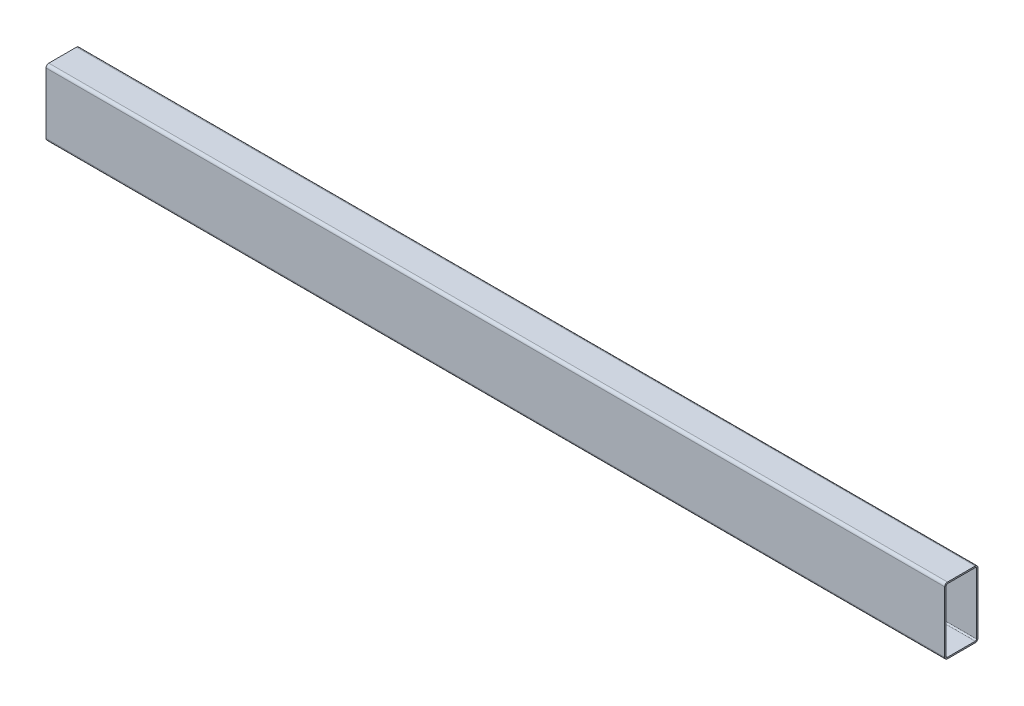
ISO-10303-21;
HEADER;
FILE_DESCRIPTION(('STEP AP214'),'2;1');
FILE_NAME('part.step','',(''),(''),'','','');
FILE_SCHEMA(('AUTOMOTIVE_DESIGN { 1 0 10303 214 1 1 1 1 }'));
ENDSEC;
DATA;
#1=APPLICATION_CONTEXT('core data for automotive mechanical design processes');
#2=APPLICATION_PROTOCOL_DEFINITION('international standard','automotive_design',2000,#1);
#3=PRODUCT_CONTEXT('',#1,'mechanical');
#4=PRODUCT('Part','Part','',(#3));
#5=PRODUCT_RELATED_PRODUCT_CATEGORY('part','',(#4));
#6=PRODUCT_DEFINITION_FORMATION('','',#4);
#7=PRODUCT_DEFINITION_CONTEXT('part definition',#1,'design');
#8=PRODUCT_DEFINITION('design','',#6,#7);
#9=PRODUCT_DEFINITION_SHAPE('','',#8);
#10=(LENGTH_UNIT() NAMED_UNIT(*) SI_UNIT(.MILLI.,.METRE.));
#11=(NAMED_UNIT(*) PLANE_ANGLE_UNIT() SI_UNIT($,.RADIAN.));
#12=(NAMED_UNIT(*) SI_UNIT($,.STERADIAN.) SOLID_ANGLE_UNIT());
#13=UNCERTAINTY_MEASURE_WITH_UNIT(LENGTH_MEASURE(1.E-05),#10,'distance_accuracy_value','');
#14=(GEOMETRIC_REPRESENTATION_CONTEXT(3) GLOBAL_UNCERTAINTY_ASSIGNED_CONTEXT((#13)) GLOBAL_UNIT_ASSIGNED_CONTEXT((#10,
#11,#12)) REPRESENTATION_CONTEXT('',''));
#15=CARTESIAN_POINT('',(0.,0.,0.));
#16=DIRECTION('',(0.,0.,1.));
#17=DIRECTION('',(1.,0.,0.));
#18=AXIS2_PLACEMENT_3D('',#15,#16,#17);
#19=CARTESIAN_POINT('',(1028.7,-7.09083333333333,9.49713055555553));
#20=DIRECTION('',(1.,0.,0.));
#21=DIRECTION('',(0.,0.,-1.));
#22=AXIS2_PLACEMENT_3D('',#19,#20,#21);
#23=PLANE('',#22);
#24=CARTESIAN_POINT('',(1028.7,-7.09083333333333,9.49713055555553));
#25=DIRECTION('',(1.,0.,0.));
#26=DIRECTION('',(0.,0.,-1.));
#27=AXIS2_PLACEMENT_3D('',#24,#25,#26);
#28=CIRCLE('',#27,3.175);
#29=CARTESIAN_POINT('',(1028.7,-7.09083333333333,12.6721305555555));
#30=VERTEX_POINT('',#29);
#31=CARTESIAN_POINT('',(1028.7,-10.2658333333333,9.49713055555553));
#32=VERTEX_POINT('',#31);
#33=EDGE_CURVE('E262',#30,#32,#28,.T.);
#34=ORIENTED_EDGE('',*,*,#33,.T.);
#35=DIRECTION('',(0.,0.,-1.));
#36=VECTOR('',#35,1.);
#37=CARTESIAN_POINT('',(1028.7,-10.2658333333333,9.49713055555553));
#38=LINE('',#37,#36);
#39=CARTESIAN_POINT('',(1028.7,-10.2658333333333,-22.2528694444445));
#40=VERTEX_POINT('',#39);
#41=EDGE_CURVE('E265',#32,#40,#38,.T.);
#42=ORIENTED_EDGE('',*,*,#41,.T.);
#43=CARTESIAN_POINT('',(1028.7,-7.09083333333333,-22.2528694444445));
#44=DIRECTION('',(1.,0.,0.));
#45=DIRECTION('',(0.,0.,-1.));
#46=AXIS2_PLACEMENT_3D('',#43,#44,#45);
#47=CIRCLE('',#46,3.175);
#48=CARTESIAN_POINT('',(1028.7,-7.09083333333333,-25.4278694444445));
#49=VERTEX_POINT('',#48);
#50=EDGE_CURVE('E268',#40,#49,#47,.T.);
#51=ORIENTED_EDGE('',*,*,#50,.T.);
#52=DIRECTION('',(0.,1.,0.));
#53=VECTOR('',#52,1.);
#54=CARTESIAN_POINT('',(1028.7,-7.09083333333333,-25.4278694444445));
#55=LINE('',#54,#53);
#56=CARTESIAN_POINT('',(1028.7,62.7591666666666,-25.4278694444445));
#57=VERTEX_POINT('',#56);
#58=EDGE_CURVE('E270',#49,#57,#55,.T.);
#59=ORIENTED_EDGE('',*,*,#58,.T.);
#60=CARTESIAN_POINT('',(1028.7,62.7591666666667,-22.2528694444445));
#61=DIRECTION('',(1.,0.,0.));
#62=DIRECTION('',(0.,0.,-1.));
#63=AXIS2_PLACEMENT_3D('',#60,#61,#62);
#64=CIRCLE('',#63,3.175);
#65=CARTESIAN_POINT('',(1028.7,65.9341666666667,-22.2528694444445));
#66=VERTEX_POINT('',#65);
#67=EDGE_CURVE('E272',#57,#66,#64,.T.);
#68=ORIENTED_EDGE('',*,*,#67,.T.);
#69=DIRECTION('',(0.,0.,-1.));
#70=VECTOR('',#69,1.);
#71=CARTESIAN_POINT('',(1028.7,65.9341666666667,9.4971305555555));
#72=LINE('',#71,#70);
#73=CARTESIAN_POINT('',(1028.7,65.9341666666667,9.4971305555555));
#74=VERTEX_POINT('',#73);
#75=EDGE_CURVE('E274',#74,#66,#72,.T.);
#76=ORIENTED_EDGE('',*,*,#75,.F.);
#77=CARTESIAN_POINT('',(1028.7,62.7591666666667,9.49713055555553));
#78=DIRECTION('',(-1.,0.,0.));
#79=DIRECTION('',(0.,0.,1.));
#80=AXIS2_PLACEMENT_3D('',#77,#78,#79);
#81=CIRCLE('',#80,3.175);
#82=CARTESIAN_POINT('',(1028.7,62.7591666666666,12.6721305555555));
#83=VERTEX_POINT('',#82);
#84=EDGE_CURVE('E277',#83,#74,#81,.T.);
#85=ORIENTED_EDGE('',*,*,#84,.F.);
#86=DIRECTION('',(0.,1.,0.));
#87=VECTOR('',#86,1.);
#88=CARTESIAN_POINT('',(1028.7,-7.09083333333333,12.6721305555555));
#89=LINE('',#88,#87);
#90=EDGE_CURVE('E280',#30,#83,#89,.T.);
#91=ORIENTED_EDGE('',*,*,#90,.F.);
#92=EDGE_LOOP('',(#34,#42,#51,#59,#68,#76,#85,#91));
#93=FACE_BOUND('',#92,.T.);
#94=DIRECTION('',(0.,0.,-1.));
#95=VECTOR('',#94,1.);
#96=CARTESIAN_POINT('',(1028.7,-8.61483333333334,9.49713055555553));
#97=LINE('',#96,#95);
#98=CARTESIAN_POINT('',(1028.7,-8.61483333333334,9.49713055555553));
#99=VERTEX_POINT('',#98);
#100=CARTESIAN_POINT('',(1028.7,-8.61483333333334,-22.2528694444445));
#101=VERTEX_POINT('',#100);
#102=EDGE_CURVE('E204',#99,#101,#97,.T.);
#103=ORIENTED_EDGE('',*,*,#102,.F.);
#104=CARTESIAN_POINT('',(1028.7,-7.09083333333333,9.49713055555553));
#105=DIRECTION('',(1.,0.,0.));
#106=DIRECTION('',(0.,0.,-1.));
#107=AXIS2_PLACEMENT_3D('',#104,#105,#106);
#108=CIRCLE('',#107,1.524);
#109=CARTESIAN_POINT('',(1028.7,-7.09083333333333,11.0211305555555));
#110=VERTEX_POINT('',#109);
#111=EDGE_CURVE('E195',#110,#99,#108,.T.);
#112=ORIENTED_EDGE('',*,*,#111,.F.);
#113=DIRECTION('',(0.,1.,0.));
#114=VECTOR('',#113,1.);
#115=CARTESIAN_POINT('',(1028.7,-7.09083333333333,11.0211305555555));
#116=LINE('',#115,#114);
#117=CARTESIAN_POINT('',(1028.7,62.7591666666666,11.0211305555555));
#118=VERTEX_POINT('',#117);
#119=EDGE_CURVE('E229',#110,#118,#116,.T.);
#120=ORIENTED_EDGE('',*,*,#119,.T.);
#121=CARTESIAN_POINT('',(1028.7,62.7591666666667,9.49713055555553));
#122=DIRECTION('',(1.,0.,0.));
#123=DIRECTION('',(0.,0.,-1.));
#124=AXIS2_PLACEMENT_3D('',#121,#122,#123);
#125=CIRCLE('',#124,1.524);
#126=CARTESIAN_POINT('',(1028.7,64.2831666666667,9.49713055555551));
#127=VERTEX_POINT('',#126);
#128=EDGE_CURVE('E98',#118,#127,#125,.F.);
#129=ORIENTED_EDGE('',*,*,#128,.T.);
#130=DIRECTION('',(0.,0.,-1.));
#131=VECTOR('',#130,1.);
#132=CARTESIAN_POINT('',(1028.7,64.2831666666667,9.4971305555555));
#133=LINE('',#132,#131);
#134=CARTESIAN_POINT('',(1028.7,64.2831666666667,-22.2528694444444));
#135=VERTEX_POINT('',#134);
#136=EDGE_CURVE('E225',#127,#135,#133,.T.);
#137=ORIENTED_EDGE('',*,*,#136,.T.);
#138=CARTESIAN_POINT('',(1028.7,62.7591666666667,-22.2528694444445));
#139=DIRECTION('',(1.,0.,0.));
#140=DIRECTION('',(0.,0.,-1.));
#141=AXIS2_PLACEMENT_3D('',#138,#139,#140);
#142=CIRCLE('',#141,1.524);
#143=CARTESIAN_POINT('',(1028.7,62.7591666666666,-23.7768694444445));
#144=VERTEX_POINT('',#143);
#145=EDGE_CURVE('E223',#144,#135,#142,.T.);
#146=ORIENTED_EDGE('',*,*,#145,.F.);
#147=DIRECTION('',(0.,1.,0.));
#148=VECTOR('',#147,1.);
#149=CARTESIAN_POINT('',(1028.7,-7.09083333333333,-23.7768694444445));
#150=LINE('',#149,#148);
#151=CARTESIAN_POINT('',(1028.7,-7.09083333333333,-23.7768694444445));
#152=VERTEX_POINT('',#151);
#153=EDGE_CURVE('E219',#152,#144,#150,.T.);
#154=ORIENTED_EDGE('',*,*,#153,.F.);
#155=CARTESIAN_POINT('',(1028.7,-7.09083333333333,-22.2528694444445));
#156=DIRECTION('',(1.,0.,0.));
#157=DIRECTION('',(0.,0.,-1.));
#158=AXIS2_PLACEMENT_3D('',#155,#156,#157);
#159=CIRCLE('',#158,1.524);
#160=EDGE_CURVE('E217',#101,#152,#159,.T.);
#161=ORIENTED_EDGE('',*,*,#160,.F.);
#162=EDGE_LOOP('',(#103,#112,#120,#129,#137,#146,#154,#161));
#163=FACE_BOUND('',#162,.T.);
#164=ADVANCED_FACE('F83',(#93,#163),#23,.T.);
#165=CARTESIAN_POINT('',(0.,-7.09083333333333,9.49713055555553));
#166=DIRECTION('',(1.,0.,0.));
#167=DIRECTION('',(0.,0.,-1.));
#168=AXIS2_PLACEMENT_3D('',#165,#166,#167);
#169=PLANE('',#168);
#170=CARTESIAN_POINT('',(0.,-7.09083333333333,9.49713055555553));
#171=DIRECTION('',(1.,0.,0.));
#172=DIRECTION('',(0.,0.,-1.));
#173=AXIS2_PLACEMENT_3D('',#170,#171,#172);
#174=CIRCLE('',#173,3.175);
#175=CARTESIAN_POINT('',(0.,-7.09083333333333,12.6721305555555));
#176=VERTEX_POINT('',#175);
#177=CARTESIAN_POINT('',(0.,-10.2658333333333,9.49713055555553));
#178=VERTEX_POINT('',#177);
#179=EDGE_CURVE('E212',#176,#178,#174,.T.);
#180=ORIENTED_EDGE('',*,*,#179,.F.);
#181=DIRECTION('',(0.,1.,0.));
#182=VECTOR('',#181,1.);
#183=CARTESIAN_POINT('',(0.,-7.09083333333333,12.6721305555555));
#184=LINE('',#183,#182);
#185=CARTESIAN_POINT('',(0.,62.7591666666666,12.6721305555555));
#186=VERTEX_POINT('',#185);
#187=EDGE_CURVE('E266',#176,#186,#184,.T.);
#188=ORIENTED_EDGE('',*,*,#187,.T.);
#189=CARTESIAN_POINT('',(0.,62.7591666666667,9.49713055555553));
#190=DIRECTION('',(-1.,0.,0.));
#191=DIRECTION('',(0.,0.,1.));
#192=AXIS2_PLACEMENT_3D('',#189,#190,#191);
#193=CIRCLE('',#192,3.175);
#194=CARTESIAN_POINT('',(0.,65.9341666666667,9.4971305555555));
#195=VERTEX_POINT('',#194);
#196=EDGE_CURVE('E298',#186,#195,#193,.T.);
#197=ORIENTED_EDGE('',*,*,#196,.T.);
#198=DIRECTION('',(0.,0.,-1.));
#199=VECTOR('',#198,1.);
#200=CARTESIAN_POINT('',(0.,65.9341666666667,9.4971305555555));
#201=LINE('',#200,#199);
#202=CARTESIAN_POINT('',(0.,65.9341666666667,-22.2528694444445));
#203=VERTEX_POINT('',#202);
#204=EDGE_CURVE('E295',#195,#203,#201,.T.);
#205=ORIENTED_EDGE('',*,*,#204,.T.);
#206=CARTESIAN_POINT('',(0.,62.7591666666667,-22.2528694444445));
#207=DIRECTION('',(1.,0.,0.));
#208=DIRECTION('',(0.,0.,-1.));
#209=AXIS2_PLACEMENT_3D('',#206,#207,#208);
#210=CIRCLE('',#209,3.175);
#211=CARTESIAN_POINT('',(0.,62.7591666666666,-25.4278694444445));
#212=VERTEX_POINT('',#211);
#213=EDGE_CURVE('E292',#212,#203,#210,.T.);
#214=ORIENTED_EDGE('',*,*,#213,.F.);
#215=DIRECTION('',(0.,1.,0.));
#216=VECTOR('',#215,1.);
#217=CARTESIAN_POINT('',(0.,-7.09083333333333,-25.4278694444445));
#218=LINE('',#217,#216);
#219=CARTESIAN_POINT('',(0.,-7.09083333333333,-25.4278694444445));
#220=VERTEX_POINT('',#219);
#221=EDGE_CURVE('E290',#220,#212,#218,.T.);
#222=ORIENTED_EDGE('',*,*,#221,.F.);
#223=CARTESIAN_POINT('',(0.,-7.09083333333333,-22.2528694444445));
#224=DIRECTION('',(1.,0.,0.));
#225=DIRECTION('',(0.,0.,-1.));
#226=AXIS2_PLACEMENT_3D('',#223,#224,#225);
#227=CIRCLE('',#226,3.175);
#228=CARTESIAN_POINT('',(0.,-10.2658333333333,-22.2528694444445));
#229=VERTEX_POINT('',#228);
#230=EDGE_CURVE('E288',#229,#220,#227,.T.);
#231=ORIENTED_EDGE('',*,*,#230,.F.);
#232=DIRECTION('',(0.,0.,-1.));
#233=VECTOR('',#232,1.);
#234=CARTESIAN_POINT('',(0.,-10.2658333333333,9.49713055555553));
#235=LINE('',#234,#233);
#236=EDGE_CURVE('E286',#178,#229,#235,.T.);
#237=ORIENTED_EDGE('',*,*,#236,.F.);
#238=EDGE_LOOP('',(#180,#188,#197,#205,#214,#222,#231,#237));
#239=FACE_BOUND('',#238,.T.);
#240=CARTESIAN_POINT('',(0.,-7.09083333333333,9.49713055555553));
#241=DIRECTION('',(1.,0.,0.));
#242=DIRECTION('',(0.,0.,-1.));
#243=AXIS2_PLACEMENT_3D('',#240,#241,#242);
#244=CIRCLE('',#243,1.524);
#245=CARTESIAN_POINT('',(0.,-7.09083333333333,11.0211305555555));
#246=VERTEX_POINT('',#245);
#247=CARTESIAN_POINT('',(0.,-8.61483333333334,9.49713055555553));
#248=VERTEX_POINT('',#247);
#249=EDGE_CURVE('E106',#246,#248,#244,.T.);
#250=ORIENTED_EDGE('',*,*,#249,.T.);
#251=DIRECTION('',(0.,0.,-1.));
#252=VECTOR('',#251,1.);
#253=CARTESIAN_POINT('',(0.,-8.61483333333334,9.49713055555553));
#254=LINE('',#253,#252);
#255=CARTESIAN_POINT('',(0.,-8.61483333333334,-22.2528694444445));
#256=VERTEX_POINT('',#255);
#257=EDGE_CURVE('E211',#248,#256,#254,.T.);
#258=ORIENTED_EDGE('',*,*,#257,.T.);
#259=CARTESIAN_POINT('',(0.,-7.09083333333333,-22.2528694444445));
#260=DIRECTION('',(1.,0.,0.));
#261=DIRECTION('',(0.,0.,-1.));
#262=AXIS2_PLACEMENT_3D('',#259,#260,#261);
#263=CIRCLE('',#262,1.524);
#264=CARTESIAN_POINT('',(0.,-7.09083333333333,-23.7768694444445));
#265=VERTEX_POINT('',#264);
#266=EDGE_CURVE('E233',#256,#265,#263,.T.);
#267=ORIENTED_EDGE('',*,*,#266,.T.);
#268=DIRECTION('',(0.,1.,0.));
#269=VECTOR('',#268,1.);
#270=CARTESIAN_POINT('',(0.,-7.09083333333333,-23.7768694444445));
#271=LINE('',#270,#269);
#272=CARTESIAN_POINT('',(0.,62.7591666666666,-23.7768694444445));
#273=VERTEX_POINT('',#272);
#274=EDGE_CURVE('E236',#265,#273,#271,.T.);
#275=ORIENTED_EDGE('',*,*,#274,.T.);
#276=CARTESIAN_POINT('',(0.,62.7591666666667,-22.2528694444445));
#277=DIRECTION('',(1.,0.,0.));
#278=DIRECTION('',(0.,0.,-1.));
#279=AXIS2_PLACEMENT_3D('',#276,#277,#278);
#280=CIRCLE('',#279,1.524);
#281=CARTESIAN_POINT('',(0.,64.2831666666667,-22.2528694444444));
#282=VERTEX_POINT('',#281);
#283=EDGE_CURVE('E239',#273,#282,#280,.T.);
#284=ORIENTED_EDGE('',*,*,#283,.T.);
#285=DIRECTION('',(0.,0.,-1.));
#286=VECTOR('',#285,1.);
#287=CARTESIAN_POINT('',(0.,64.2831666666667,9.4971305555555));
#288=LINE('',#287,#286);
#289=CARTESIAN_POINT('',(0.,64.2831666666667,9.49713055555551));
#290=VERTEX_POINT('',#289);
#291=EDGE_CURVE('E242',#290,#282,#288,.T.);
#292=ORIENTED_EDGE('',*,*,#291,.F.);
#293=CARTESIAN_POINT('',(0.,62.7591666666667,9.49713055555553));
#294=DIRECTION('',(1.,0.,0.));
#295=DIRECTION('',(0.,0.,-1.));
#296=AXIS2_PLACEMENT_3D('',#293,#294,#295);
#297=CIRCLE('',#296,1.524);
#298=CARTESIAN_POINT('',(0.,62.7591666666666,11.0211305555555));
#299=VERTEX_POINT('',#298);
#300=EDGE_CURVE('E245',#299,#290,#297,.F.);
#301=ORIENTED_EDGE('',*,*,#300,.F.);
#302=DIRECTION('',(0.,1.,0.));
#303=VECTOR('',#302,1.);
#304=CARTESIAN_POINT('',(0.,-7.09083333333333,11.0211305555555));
#305=LINE('',#304,#303);
#306=EDGE_CURVE('E205',#246,#299,#305,.T.);
#307=ORIENTED_EDGE('',*,*,#306,.F.);
#308=EDGE_LOOP('',(#250,#258,#267,#275,#284,#292,#301,#307));
#309=FACE_BOUND('',#308,.T.);
#310=ADVANCED_FACE('F326',(#239,#309),#169,.F.);
#311=CARTESIAN_POINT('',(1028.7,-7.09083333333333,9.49713055555553));
#312=DIRECTION('',(-1.,0.,0.));
#313=DIRECTION('',(0.,0.,1.));
#314=AXIS2_PLACEMENT_3D('',#311,#312,#313);
#315=CYLINDRICAL_SURFACE('',#314,3.175);
#316=ORIENTED_EDGE('',*,*,#179,.T.);
#317=DIRECTION('',(-1.,0.,0.));
#318=VECTOR('',#317,1.);
#319=CARTESIAN_POINT('',(1028.7,-10.2658333333333,9.49713055555553));
#320=LINE('',#319,#318);
#321=EDGE_CURVE('E12',#32,#178,#320,.T.);
#322=ORIENTED_EDGE('',*,*,#321,.F.);
#323=ORIENTED_EDGE('',*,*,#33,.F.);
#324=DIRECTION('',(-1.,0.,0.));
#325=VECTOR('',#324,1.);
#326=CARTESIAN_POINT('',(1028.7,-7.09083333333333,12.6721305555555));
#327=LINE('',#326,#325);
#328=EDGE_CURVE('E283',#30,#176,#327,.T.);
#329=ORIENTED_EDGE('',*,*,#328,.T.);
#330=EDGE_LOOP('',(#316,#322,#323,#329));
#331=FACE_BOUND('',#330,.T.);
#332=ADVANCED_FACE('F85',(#331),#315,.T.);
#333=CARTESIAN_POINT('',(1028.7,-10.2658333333333,9.49713055555553));
#334=DIRECTION('',(0.,1.,0.));
#335=DIRECTION('',(0.,0.,1.));
#336=AXIS2_PLACEMENT_3D('',#333,#334,#335);
#337=PLANE('',#336);
#338=ORIENTED_EDGE('',*,*,#236,.T.);
#339=DIRECTION('',(-1.,0.,0.));
#340=VECTOR('',#339,1.);
#341=CARTESIAN_POINT('',(1028.7,-10.2658333333333,-22.2528694444445));
#342=LINE('',#341,#340);
#343=EDGE_CURVE('E91',#40,#229,#342,.T.);
#344=ORIENTED_EDGE('',*,*,#343,.F.);
#345=ORIENTED_EDGE('',*,*,#41,.F.);
#346=ORIENTED_EDGE('',*,*,#321,.T.);
#347=EDGE_LOOP('',(#338,#344,#345,#346));
#348=FACE_BOUND('',#347,.T.);
#349=ADVANCED_FACE('F343',(#348),#337,.F.);
#350=CARTESIAN_POINT('',(1028.7,-7.09083333333333,-22.2528694444445));
#351=DIRECTION('',(-1.,0.,0.));
#352=DIRECTION('',(0.,0.,1.));
#353=AXIS2_PLACEMENT_3D('',#350,#351,#352);
#354=CYLINDRICAL_SURFACE('',#353,3.175);
#355=ORIENTED_EDGE('',*,*,#230,.T.);
#356=DIRECTION('',(-1.,0.,0.));
#357=VECTOR('',#356,1.);
#358=CARTESIAN_POINT('',(1028.7,-7.09083333333333,-25.4278694444445));
#359=LINE('',#358,#357);
#360=EDGE_CURVE('E313',#49,#220,#359,.T.);
#361=ORIENTED_EDGE('',*,*,#360,.F.);
#362=ORIENTED_EDGE('',*,*,#50,.F.);
#363=ORIENTED_EDGE('',*,*,#343,.T.);
#364=EDGE_LOOP('',(#355,#361,#362,#363));
#365=FACE_BOUND('',#364,.T.);
#366=ADVANCED_FACE('F320',(#365),#354,.T.);
#367=CARTESIAN_POINT('',(1028.7,-7.09083333333333,-25.4278694444445));
#368=DIRECTION('',(0.,0.,1.));
#369=DIRECTION('',(1.,0.,0.));
#370=AXIS2_PLACEMENT_3D('',#367,#368,#369);
#371=PLANE('',#370);
#372=ORIENTED_EDGE('',*,*,#221,.T.);
#373=DIRECTION('',(-1.,0.,0.));
#374=VECTOR('',#373,1.);
#375=CARTESIAN_POINT('',(1028.7,62.7591666666666,-25.4278694444445));
#376=LINE('',#375,#374);
#377=EDGE_CURVE('E310',#57,#212,#376,.T.);
#378=ORIENTED_EDGE('',*,*,#377,.F.);
#379=ORIENTED_EDGE('',*,*,#58,.F.);
#380=ORIENTED_EDGE('',*,*,#360,.T.);
#381=EDGE_LOOP('',(#372,#378,#379,#380));
#382=FACE_BOUND('',#381,.T.);
#383=ADVANCED_FACE('F331',(#382),#371,.F.);
#384=CARTESIAN_POINT('',(1028.7,62.7591666666667,-22.2528694444445));
#385=DIRECTION('',(-1.,0.,0.));
#386=DIRECTION('',(0.,0.,1.));
#387=AXIS2_PLACEMENT_3D('',#384,#385,#386);
#388=CYLINDRICAL_SURFACE('',#387,3.175);
#389=ORIENTED_EDGE('',*,*,#213,.T.);
#390=DIRECTION('',(-1.,0.,0.));
#391=VECTOR('',#390,1.);
#392=CARTESIAN_POINT('',(1028.7,65.9341666666667,-22.2528694444445));
#393=LINE('',#392,#391);
#394=EDGE_CURVE('E308',#66,#203,#393,.T.);
#395=ORIENTED_EDGE('',*,*,#394,.F.);
#396=ORIENTED_EDGE('',*,*,#67,.F.);
#397=ORIENTED_EDGE('',*,*,#377,.T.);
#398=EDGE_LOOP('',(#389,#395,#396,#397));
#399=FACE_BOUND('',#398,.T.);
#400=ADVANCED_FACE('F335',(#399),#388,.T.);
#401=CARTESIAN_POINT('',(1028.7,65.9341666666667,9.4971305555555));
#402=DIRECTION('',(0.,1.,0.));
#403=DIRECTION('',(0.,0.,1.));
#404=AXIS2_PLACEMENT_3D('',#401,#402,#403);
#405=PLANE('',#404);
#406=ORIENTED_EDGE('',*,*,#204,.F.);
#407=DIRECTION('',(-1.,0.,0.));
#408=VECTOR('',#407,1.);
#409=CARTESIAN_POINT('',(1028.7,65.9341666666667,9.4971305555555));
#410=LINE('',#409,#408);
#411=EDGE_CURVE('E306',#74,#195,#410,.T.);
#412=ORIENTED_EDGE('',*,*,#411,.F.);
#413=ORIENTED_EDGE('',*,*,#75,.T.);
#414=ORIENTED_EDGE('',*,*,#394,.T.);
#415=EDGE_LOOP('',(#406,#412,#413,#414));
#416=FACE_BOUND('',#415,.T.);
#417=ADVANCED_FACE('F353',(#416),#405,.T.);
#418=CARTESIAN_POINT('',(1028.7,62.7591666666667,9.49713055555553));
#419=DIRECTION('',(-1.,0.,0.));
#420=DIRECTION('',(0.,0.,1.));
#421=AXIS2_PLACEMENT_3D('',#418,#419,#420);
#422=CYLINDRICAL_SURFACE('',#421,3.175);
#423=ORIENTED_EDGE('',*,*,#196,.F.);
#424=DIRECTION('',(-1.,0.,0.));
#425=VECTOR('',#424,1.);
#426=CARTESIAN_POINT('',(1028.7,62.7591666666666,12.6721305555555));
#427=LINE('',#426,#425);
#428=EDGE_CURVE('E304',#83,#186,#427,.T.);
#429=ORIENTED_EDGE('',*,*,#428,.F.);
#430=ORIENTED_EDGE('',*,*,#84,.T.);
#431=ORIENTED_EDGE('',*,*,#411,.T.);
#432=EDGE_LOOP('',(#423,#429,#430,#431));
#433=FACE_BOUND('',#432,.T.);
#434=ADVANCED_FACE('F350',(#433),#422,.T.);
#435=CARTESIAN_POINT('',(1028.7,-7.09083333333333,12.6721305555555));
#436=DIRECTION('',(0.,0.,1.));
#437=DIRECTION('',(1.,0.,0.));
#438=AXIS2_PLACEMENT_3D('',#435,#436,#437);
#439=PLANE('',#438);
#440=ORIENTED_EDGE('',*,*,#187,.F.);
#441=ORIENTED_EDGE('',*,*,#328,.F.);
#442=ORIENTED_EDGE('',*,*,#90,.T.);
#443=ORIENTED_EDGE('',*,*,#428,.T.);
#444=EDGE_LOOP('',(#440,#441,#442,#443));
#445=FACE_BOUND('',#444,.T.);
#446=ADVANCED_FACE('F347',(#445),#439,.T.);
#447=CARTESIAN_POINT('',(1028.7,-7.09083333333333,9.49713055555553));
#448=DIRECTION('',(-1.,0.,0.));
#449=DIRECTION('',(0.,0.,1.));
#450=AXIS2_PLACEMENT_3D('',#447,#448,#449);
#451=CYLINDRICAL_SURFACE('',#450,1.524);
#452=ORIENTED_EDGE('',*,*,#249,.F.);
#453=DIRECTION('',(-1.,0.,0.));
#454=VECTOR('',#453,1.);
#455=CARTESIAN_POINT('',(1028.7,-7.09083333333333,11.0211305555555));
#456=LINE('',#455,#454);
#457=EDGE_CURVE('E199',#110,#246,#456,.T.);
#458=ORIENTED_EDGE('',*,*,#457,.F.);
#459=ORIENTED_EDGE('',*,*,#111,.T.);
#460=DIRECTION('',(-1.,0.,0.));
#461=VECTOR('',#460,1.);
#462=CARTESIAN_POINT('',(1028.7,-8.61483333333334,9.49713055555553));
#463=LINE('',#462,#461);
#464=EDGE_CURVE('E198',#99,#248,#463,.T.);
#465=ORIENTED_EDGE('',*,*,#464,.T.);
#466=EDGE_LOOP('',(#452,#458,#459,#465));
#467=FACE_BOUND('',#466,.T.);
#468=ADVANCED_FACE('F197',(#467),#451,.F.);
#469=CARTESIAN_POINT('',(1028.7,-8.61483333333334,9.49713055555553));
#470=DIRECTION('',(0.,1.,0.));
#471=DIRECTION('',(0.,0.,1.));
#472=AXIS2_PLACEMENT_3D('',#469,#470,#471);
#473=PLANE('',#472);
#474=ORIENTED_EDGE('',*,*,#257,.F.);
#475=ORIENTED_EDGE('',*,*,#464,.F.);
#476=ORIENTED_EDGE('',*,*,#102,.T.);
#477=DIRECTION('',(-1.,0.,0.));
#478=VECTOR('',#477,1.);
#479=CARTESIAN_POINT('',(1028.7,-8.61483333333334,-22.2528694444445));
#480=LINE('',#479,#478);
#481=EDGE_CURVE('E213',#101,#256,#480,.T.);
#482=ORIENTED_EDGE('',*,*,#481,.T.);
#483=EDGE_LOOP('',(#474,#475,#476,#482));
#484=FACE_BOUND('',#483,.T.);
#485=ADVANCED_FACE('F208',(#484),#473,.T.);
#486=CARTESIAN_POINT('',(1028.7,-7.09083333333333,-22.2528694444445));
#487=DIRECTION('',(-1.,0.,0.));
#488=DIRECTION('',(0.,0.,1.));
#489=AXIS2_PLACEMENT_3D('',#486,#487,#488);
#490=CYLINDRICAL_SURFACE('',#489,1.524);
#491=ORIENTED_EDGE('',*,*,#266,.F.);
#492=ORIENTED_EDGE('',*,*,#481,.F.);
#493=ORIENTED_EDGE('',*,*,#160,.T.);
#494=DIRECTION('',(-1.,0.,0.));
#495=VECTOR('',#494,1.);
#496=CARTESIAN_POINT('',(1028.7,-7.09083333333333,-23.7768694444445));
#497=LINE('',#496,#495);
#498=EDGE_CURVE('E259',#152,#265,#497,.T.);
#499=ORIENTED_EDGE('',*,*,#498,.T.);
#500=EDGE_LOOP('',(#491,#492,#493,#499));
#501=FACE_BOUND('',#500,.T.);
#502=ADVANCED_FACE('F378',(#501),#490,.F.);
#503=CARTESIAN_POINT('',(1028.7,-7.09083333333333,-23.7768694444445));
#504=DIRECTION('',(0.,0.,1.));
#505=DIRECTION('',(1.,0.,0.));
#506=AXIS2_PLACEMENT_3D('',#503,#504,#505);
#507=PLANE('',#506);
#508=ORIENTED_EDGE('',*,*,#274,.F.);
#509=ORIENTED_EDGE('',*,*,#498,.F.);
#510=ORIENTED_EDGE('',*,*,#153,.T.);
#511=DIRECTION('',(-1.,0.,0.));
#512=VECTOR('',#511,1.);
#513=CARTESIAN_POINT('',(1028.7,62.7591666666666,-23.7768694444445));
#514=LINE('',#513,#512);
#515=EDGE_CURVE('E257',#144,#273,#514,.T.);
#516=ORIENTED_EDGE('',*,*,#515,.T.);
#517=EDGE_LOOP('',(#508,#509,#510,#516));
#518=FACE_BOUND('',#517,.T.);
#519=ADVANCED_FACE('F382',(#518),#507,.T.);
#520=CARTESIAN_POINT('',(1028.7,62.7591666666667,-22.2528694444445));
#521=DIRECTION('',(-1.,0.,0.));
#522=DIRECTION('',(0.,0.,1.));
#523=AXIS2_PLACEMENT_3D('',#520,#521,#522);
#524=CYLINDRICAL_SURFACE('',#523,1.524);
#525=ORIENTED_EDGE('',*,*,#283,.F.);
#526=ORIENTED_EDGE('',*,*,#515,.F.);
#527=ORIENTED_EDGE('',*,*,#145,.T.);
#528=DIRECTION('',(-1.,0.,0.));
#529=VECTOR('',#528,1.);
#530=CARTESIAN_POINT('',(1028.7,64.2831666666667,-22.2528694444444));
#531=LINE('',#530,#529);
#532=EDGE_CURVE('E255',#135,#282,#531,.T.);
#533=ORIENTED_EDGE('',*,*,#532,.T.);
#534=EDGE_LOOP('',(#525,#526,#527,#533));
#535=FACE_BOUND('',#534,.T.);
#536=ADVANCED_FACE('F388',(#535),#524,.F.);
#537=CARTESIAN_POINT('',(1028.7,64.2831666666667,9.4971305555555));
#538=DIRECTION('',(0.,1.,0.));
#539=DIRECTION('',(0.,0.,1.));
#540=AXIS2_PLACEMENT_3D('',#537,#538,#539);
#541=PLANE('',#540);
#542=ORIENTED_EDGE('',*,*,#291,.T.);
#543=ORIENTED_EDGE('',*,*,#532,.F.);
#544=ORIENTED_EDGE('',*,*,#136,.F.);
#545=DIRECTION('',(-1.,0.,0.));
#546=VECTOR('',#545,1.);
#547=CARTESIAN_POINT('',(1028.7,64.2831666666667,9.49713055555551));
#548=LINE('',#547,#546);
#549=EDGE_CURVE('E253',#127,#290,#548,.T.);
#550=ORIENTED_EDGE('',*,*,#549,.T.);
#551=EDGE_LOOP('',(#542,#543,#544,#550));
#552=FACE_BOUND('',#551,.T.);
#553=ADVANCED_FACE('F392',(#552),#541,.F.);
#554=CARTESIAN_POINT('',(1028.7,62.7591666666667,9.49713055555553));
#555=DIRECTION('',(-1.,0.,0.));
#556=DIRECTION('',(0.,0.,1.));
#557=AXIS2_PLACEMENT_3D('',#554,#555,#556);
#558=CYLINDRICAL_SURFACE('',#557,1.524);
#559=ORIENTED_EDGE('',*,*,#300,.T.);
#560=ORIENTED_EDGE('',*,*,#549,.F.);
#561=ORIENTED_EDGE('',*,*,#128,.F.);
#562=DIRECTION('',(-1.,0.,0.));
#563=VECTOR('',#562,1.);
#564=CARTESIAN_POINT('',(1028.7,62.7591666666666,11.0211305555555));
#565=LINE('',#564,#563);
#566=EDGE_CURVE('E251',#118,#299,#565,.T.);
#567=ORIENTED_EDGE('',*,*,#566,.T.);
#568=EDGE_LOOP('',(#559,#560,#561,#567));
#569=FACE_BOUND('',#568,.T.);
#570=ADVANCED_FACE('F396',(#569),#558,.F.);
#571=CARTESIAN_POINT('',(1028.7,-7.09083333333333,11.0211305555555));
#572=DIRECTION('',(0.,0.,1.));
#573=DIRECTION('',(1.,0.,0.));
#574=AXIS2_PLACEMENT_3D('',#571,#572,#573);
#575=PLANE('',#574);
#576=ORIENTED_EDGE('',*,*,#306,.T.);
#577=ORIENTED_EDGE('',*,*,#566,.F.);
#578=ORIENTED_EDGE('',*,*,#119,.F.);
#579=ORIENTED_EDGE('',*,*,#457,.T.);
#580=EDGE_LOOP('',(#576,#577,#578,#579));
#581=FACE_BOUND('',#580,.T.);
#582=ADVANCED_FACE('F400',(#581),#575,.F.);
#583=CLOSED_SHELL('',(#164,#310,#332,#349,#366,#383,#400,#417,#434,#446,#468,#485,#502,#519,
#536,#553,#570,#582));
#584=MANIFOLD_SOLID_BREP('B2',#583);
#585=ADVANCED_BREP_SHAPE_REPRESENTATION('',(#18,#584),#14);
#586=SHAPE_DEFINITION_REPRESENTATION(#9,#585);
ENDSEC;
END-ISO-10303-21;
